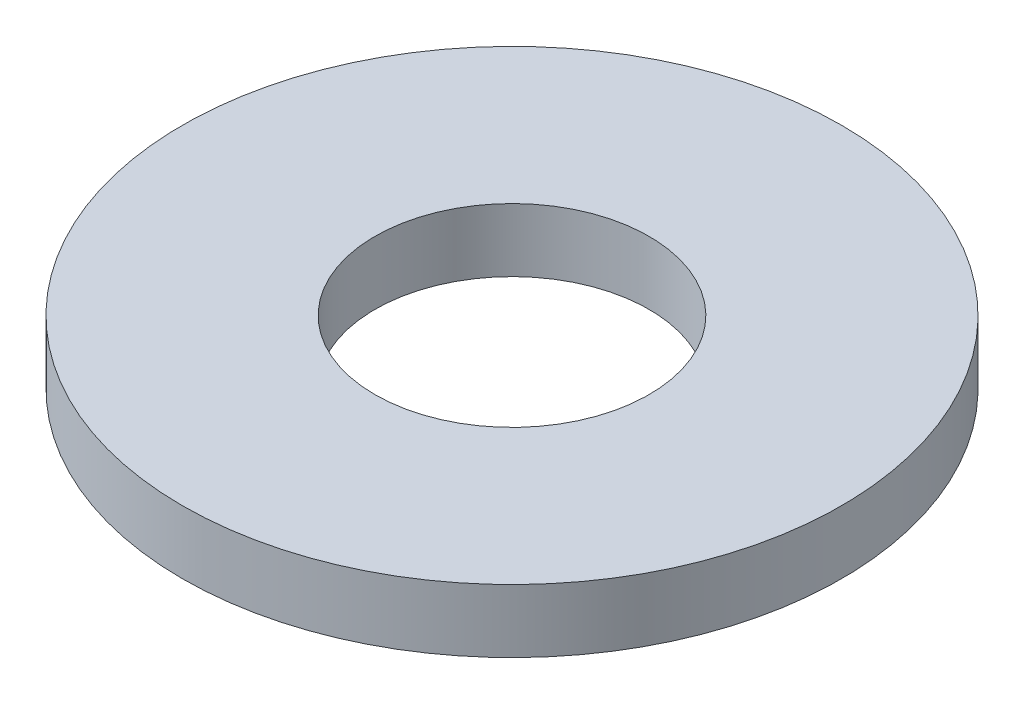
ISO-10303-21;
HEADER;
FILE_DESCRIPTION(('STEP AP214'),'2;1');
FILE_NAME('part.step','',(''),(''),'','','');
FILE_SCHEMA(('AUTOMOTIVE_DESIGN { 1 0 10303 214 1 1 1 1 }'));
ENDSEC;
DATA;
#1=APPLICATION_CONTEXT('core data for automotive mechanical design processes');
#2=APPLICATION_PROTOCOL_DEFINITION('international standard','automotive_design',2000,#1);
#3=PRODUCT_CONTEXT('',#1,'mechanical');
#4=PRODUCT('Part','Part','',(#3));
#5=PRODUCT_RELATED_PRODUCT_CATEGORY('part','',(#4));
#6=PRODUCT_DEFINITION_FORMATION('','',#4);
#7=PRODUCT_DEFINITION_CONTEXT('part definition',#1,'design');
#8=PRODUCT_DEFINITION('design','',#6,#7);
#9=PRODUCT_DEFINITION_SHAPE('','',#8);
#10=(LENGTH_UNIT() NAMED_UNIT(*) SI_UNIT(.MILLI.,.METRE.));
#11=(NAMED_UNIT(*) PLANE_ANGLE_UNIT() SI_UNIT($,.RADIAN.));
#12=(NAMED_UNIT(*) SI_UNIT($,.STERADIAN.) SOLID_ANGLE_UNIT());
#13=UNCERTAINTY_MEASURE_WITH_UNIT(LENGTH_MEASURE(1.E-05),#10,'distance_accuracy_value','');
#14=(GEOMETRIC_REPRESENTATION_CONTEXT(3) GLOBAL_UNCERTAINTY_ASSIGNED_CONTEXT((#13)) GLOBAL_UNIT_ASSIGNED_CONTEXT((#10,
#11,#12)) REPRESENTATION_CONTEXT('',''));
#15=CARTESIAN_POINT('',(0.,0.,0.));
#16=DIRECTION('',(0.,0.,1.));
#17=DIRECTION('',(1.,0.,0.));
#18=AXIS2_PLACEMENT_3D('',#15,#16,#17);
#19=CARTESIAN_POINT('',(0.,1.8288,0.));
#20=DIRECTION('',(0.,-1.,0.));
#21=DIRECTION('',(0.,0.,-1.));
#22=AXIS2_PLACEMENT_3D('',#19,#20,#21);
#23=CYLINDRICAL_SURFACE('',#22,9.525);
#24=CARTESIAN_POINT('',(0.,1.8288,0.));
#25=DIRECTION('',(0.,1.,0.));
#26=DIRECTION('',(0.,0.,1.));
#27=AXIS2_PLACEMENT_3D('',#24,#25,#26);
#28=CIRCLE('',#27,9.525);
#29=CARTESIAN_POINT('',(0.,1.8288,9.525));
#30=VERTEX_POINT('',#29);
#31=EDGE_CURVE('E10',#30,#30,#28,.T.);
#32=ORIENTED_EDGE('',*,*,#31,.F.);
#33=EDGE_LOOP('',(#32));
#34=FACE_BOUND('',#33,.T.);
#35=CARTESIAN_POINT('',(0.,0.,0.));
#36=DIRECTION('',(0.,1.,0.));
#37=DIRECTION('',(0.,0.,1.));
#38=AXIS2_PLACEMENT_3D('',#35,#36,#37);
#39=CIRCLE('',#38,9.525);
#40=CARTESIAN_POINT('',(0.,0.,9.525));
#41=VERTEX_POINT('',#40);
#42=EDGE_CURVE('E33',#41,#41,#39,.T.);
#43=ORIENTED_EDGE('',*,*,#42,.T.);
#44=EDGE_LOOP('',(#43));
#45=FACE_BOUND('',#44,.T.);
#46=ADVANCED_FACE('F30',(#34,#45),#23,.T.);
#47=CARTESIAN_POINT('',(0.,1.8288,0.));
#48=DIRECTION('',(0.,1.,0.));
#49=DIRECTION('',(0.,0.,1.));
#50=AXIS2_PLACEMENT_3D('',#47,#48,#49);
#51=PLANE('',#50);
#52=CARTESIAN_POINT('',(0.,1.8288,0.));
#53=DIRECTION('',(0.,1.,0.));
#54=DIRECTION('',(0.,0.,1.));
#55=AXIS2_PLACEMENT_3D('',#52,#53,#54);
#56=CIRCLE('',#55,3.9624);
#57=CARTESIAN_POINT('',(0.,1.8288,3.9624));
#58=VERTEX_POINT('',#57);
#59=EDGE_CURVE('E42',#58,#58,#56,.T.);
#60=ORIENTED_EDGE('',*,*,#59,.F.);
#61=EDGE_LOOP('',(#60));
#62=FACE_BOUND('',#61,.T.);
#63=ORIENTED_EDGE('',*,*,#31,.T.);
#64=EDGE_LOOP('',(#63));
#65=FACE_BOUND('',#64,.T.);
#66=ADVANCED_FACE('F57',(#62,#65),#51,.T.);
#67=CARTESIAN_POINT('',(0.,0.,0.));
#68=DIRECTION('',(0.,1.,0.));
#69=DIRECTION('',(0.,0.,1.));
#70=AXIS2_PLACEMENT_3D('',#67,#68,#69);
#71=PLANE('',#70);
#72=CARTESIAN_POINT('',(0.,0.,0.));
#73=DIRECTION('',(0.,1.,0.));
#74=DIRECTION('',(0.,0.,1.));
#75=AXIS2_PLACEMENT_3D('',#72,#73,#74);
#76=CIRCLE('',#75,3.9624);
#77=CARTESIAN_POINT('',(0.,0.,3.9624));
#78=VERTEX_POINT('',#77);
#79=EDGE_CURVE('E40',#78,#78,#76,.T.);
#80=ORIENTED_EDGE('',*,*,#79,.T.);
#81=EDGE_LOOP('',(#80));
#82=FACE_BOUND('',#81,.T.);
#83=ORIENTED_EDGE('',*,*,#42,.F.);
#84=EDGE_LOOP('',(#83));
#85=FACE_BOUND('',#84,.T.);
#86=ADVANCED_FACE('F48',(#82,#85),#71,.F.);
#87=CARTESIAN_POINT('',(0.,0.,0.));
#88=DIRECTION('',(0.,1.,0.));
#89=DIRECTION('',(0.,0.,1.));
#90=AXIS2_PLACEMENT_3D('',#87,#88,#89);
#91=CYLINDRICAL_SURFACE('',#90,3.9624);
#92=ORIENTED_EDGE('',*,*,#79,.F.);
#93=EDGE_LOOP('',(#92));
#94=FACE_BOUND('',#93,.T.);
#95=ORIENTED_EDGE('',*,*,#59,.T.);
#96=EDGE_LOOP('',(#95));
#97=FACE_BOUND('',#96,.T.);
#98=ADVANCED_FACE('F51',(#94,#97),#91,.F.);
#99=CLOSED_SHELL('',(#46,#66,#86,#98));
#100=MANIFOLD_SOLID_BREP('B2',#99);
#101=ADVANCED_BREP_SHAPE_REPRESENTATION('',(#18,#100),#14);
#102=SHAPE_DEFINITION_REPRESENTATION(#9,#101);
ENDSEC;
END-ISO-10303-21;
